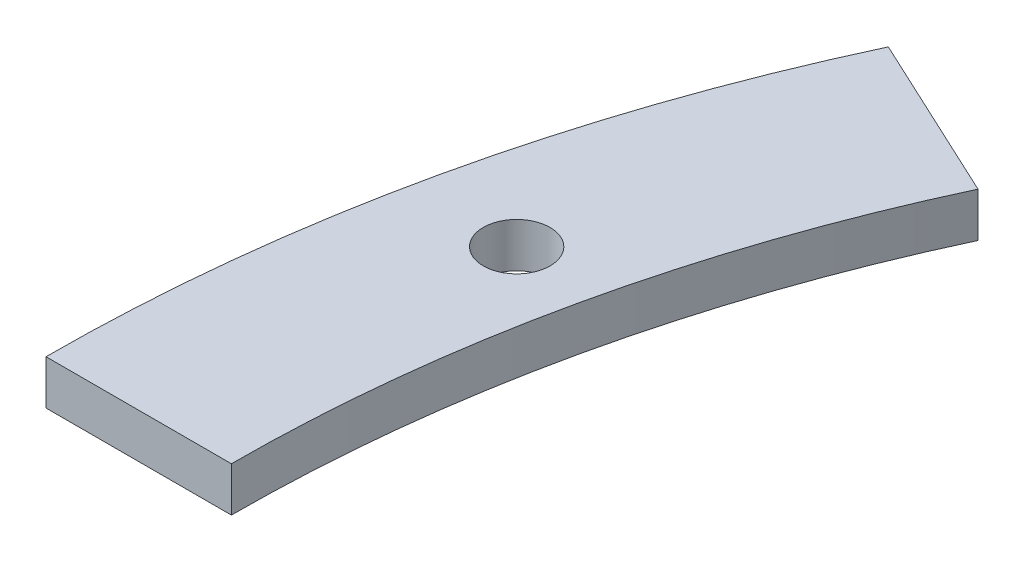
ISO-10303-21;
HEADER;
FILE_DESCRIPTION(('STEP AP214'),'2;1');
FILE_NAME('part.step','',(''),(''),'','','');
FILE_SCHEMA(('AUTOMOTIVE_DESIGN { 1 0 10303 214 1 1 1 1 }'));
ENDSEC;
DATA;
#1=APPLICATION_CONTEXT('core data for automotive mechanical design processes');
#2=APPLICATION_PROTOCOL_DEFINITION('international standard','automotive_design',2000,#1);
#3=PRODUCT_CONTEXT('',#1,'mechanical');
#4=PRODUCT('Part','Part','',(#3));
#5=PRODUCT_RELATED_PRODUCT_CATEGORY('part','',(#4));
#6=PRODUCT_DEFINITION_FORMATION('','',#4);
#7=PRODUCT_DEFINITION_CONTEXT('part definition',#1,'design');
#8=PRODUCT_DEFINITION('design','',#6,#7);
#9=PRODUCT_DEFINITION_SHAPE('','',#8);
#10=(LENGTH_UNIT() NAMED_UNIT(*) SI_UNIT(.MILLI.,.METRE.));
#11=(NAMED_UNIT(*) PLANE_ANGLE_UNIT() SI_UNIT($,.RADIAN.));
#12=(NAMED_UNIT(*) SI_UNIT($,.STERADIAN.) SOLID_ANGLE_UNIT());
#13=UNCERTAINTY_MEASURE_WITH_UNIT(LENGTH_MEASURE(1.E-05),#10,'distance_accuracy_value','');
#14=(GEOMETRIC_REPRESENTATION_CONTEXT(3) GLOBAL_UNCERTAINTY_ASSIGNED_CONTEXT((#13)) GLOBAL_UNIT_ASSIGNED_CONTEXT((#10,
#11,#12)) REPRESENTATION_CONTEXT('',''));
#15=CARTESIAN_POINT('',(0.,0.,0.));
#16=DIRECTION('',(0.,0.,1.));
#17=DIRECTION('',(1.,0.,0.));
#18=AXIS2_PLACEMENT_3D('',#15,#16,#17);
#19=CARTESIAN_POINT('',(0.,3.,0.));
#20=DIRECTION('',(0.,-1.,0.));
#21=DIRECTION('',(0.,0.,-1.));
#22=AXIS2_PLACEMENT_3D('',#19,#20,#21);
#23=CYLINDRICAL_SURFACE('',#22,97.5);
#24=CARTESIAN_POINT('',(0.,0.,0.));
#25=DIRECTION('',(0.,-1.,0.));
#26=DIRECTION('',(0.,0.,1.));
#27=AXIS2_PLACEMENT_3D('',#24,#25,#26);
#28=CIRCLE('',#27,97.5);
#29=CARTESIAN_POINT('',(-97.5,0.,0.));
#30=VERTEX_POINT('',#29);
#31=CARTESIAN_POINT('',(-88.3650092360733,0.,-41.2052805197183));
#32=VERTEX_POINT('',#31);
#33=EDGE_CURVE('E102',#30,#32,#28,.T.);
#34=ORIENTED_EDGE('',*,*,#33,.T.);
#35=DIRECTION('',(0.,-1.,0.));
#36=VECTOR('',#35,1.);
#37=CARTESIAN_POINT('',(-88.3650092360733,3.,-41.2052805197183));
#38=LINE('',#37,#36);
#39=CARTESIAN_POINT('',(-88.3650092360733,3.,-41.2052805197183));
#40=VERTEX_POINT('',#39);
#41=EDGE_CURVE('E11',#40,#32,#38,.T.);
#42=ORIENTED_EDGE('',*,*,#41,.F.);
#43=CARTESIAN_POINT('',(0.,3.,0.));
#44=DIRECTION('',(0.,-1.,0.));
#45=DIRECTION('',(0.,0.,1.));
#46=AXIS2_PLACEMENT_3D('',#43,#44,#45);
#47=CIRCLE('',#46,97.5);
#48=CARTESIAN_POINT('',(-97.5,3.,0.));
#49=VERTEX_POINT('',#48);
#50=EDGE_CURVE('E89',#49,#40,#47,.T.);
#51=ORIENTED_EDGE('',*,*,#50,.F.);
#52=DIRECTION('',(0.,-1.,0.));
#53=VECTOR('',#52,1.);
#54=CARTESIAN_POINT('',(-97.5,3.,0.));
#55=LINE('',#54,#53);
#56=EDGE_CURVE('E98',#49,#30,#55,.T.);
#57=ORIENTED_EDGE('',*,*,#56,.T.);
#58=EDGE_LOOP('',(#34,#42,#51,#57));
#59=FACE_BOUND('',#58,.T.);
#60=ADVANCED_FACE('F37',(#59),#23,.F.);
#61=CARTESIAN_POINT('',(-99.6938565740315,3.,-46.488008791477));
#62=DIRECTION('',(-0.4226182617407,0.,0.90630778703665));
#63=DIRECTION('',(0.90630778703665,0.,0.4226182617407));
#64=AXIS2_PLACEMENT_3D('',#61,#62,#63);
#65=PLANE('',#64);
#66=DIRECTION('',(-0.90630778703665,0.,-0.4226182617407));
#67=VECTOR('',#66,1.);
#68=CARTESIAN_POINT('',(-99.6938565740315,0.,-46.488008791477));
#69=LINE('',#68,#67);
#70=CARTESIAN_POINT('',(-99.6938565740314,0.,-46.4880087914771));
#71=VERTEX_POINT('',#70);
#72=EDGE_CURVE('E93',#32,#71,#69,.T.);
#73=ORIENTED_EDGE('',*,*,#72,.T.);
#74=DIRECTION('',(0.,-1.,0.));
#75=VECTOR('',#74,1.);
#76=CARTESIAN_POINT('',(-99.6938565740314,3.,-46.4880087914771));
#77=LINE('',#76,#75);
#78=CARTESIAN_POINT('',(-99.6938565740314,3.,-46.4880087914771));
#79=VERTEX_POINT('',#78);
#80=EDGE_CURVE('E46',#79,#71,#77,.T.);
#81=ORIENTED_EDGE('',*,*,#80,.F.);
#82=DIRECTION('',(-0.90630778703665,0.,-0.4226182617407));
#83=VECTOR('',#82,1.);
#84=CARTESIAN_POINT('',(-99.6938565740315,3.,-46.488008791477));
#85=LINE('',#84,#83);
#86=EDGE_CURVE('E84',#40,#79,#85,.T.);
#87=ORIENTED_EDGE('',*,*,#86,.F.);
#88=ORIENTED_EDGE('',*,*,#41,.T.);
#89=EDGE_LOOP('',(#73,#81,#87,#88));
#90=FACE_BOUND('',#89,.T.);
#91=ADVANCED_FACE('F92',(#90),#65,.F.);
#92=CARTESIAN_POINT('',(0.,3.,0.));
#93=DIRECTION('',(0.,-1.,0.));
#94=DIRECTION('',(0.,0.,-1.));
#95=AXIS2_PLACEMENT_3D('',#92,#93,#94);
#96=CYLINDRICAL_SURFACE('',#95,110.);
#97=CARTESIAN_POINT('',(0.,0.,0.));
#98=DIRECTION('',(0.,1.,0.));
#99=DIRECTION('',(0.,0.,1.));
#100=AXIS2_PLACEMENT_3D('',#97,#98,#99);
#101=CIRCLE('',#100,110.);
#102=CARTESIAN_POINT('',(-110.,0.,0.));
#103=VERTEX_POINT('',#102);
#104=EDGE_CURVE('E71',#71,#103,#101,.T.);
#105=ORIENTED_EDGE('',*,*,#104,.T.);
#106=DIRECTION('',(0.,-1.,0.));
#107=VECTOR('',#106,1.);
#108=CARTESIAN_POINT('',(-110.,3.,0.));
#109=LINE('',#108,#107);
#110=CARTESIAN_POINT('',(-110.,3.,0.));
#111=VERTEX_POINT('',#110);
#112=EDGE_CURVE('E94',#111,#103,#109,.T.);
#113=ORIENTED_EDGE('',*,*,#112,.F.);
#114=CARTESIAN_POINT('',(0.,3.,0.));
#115=DIRECTION('',(0.,1.,0.));
#116=DIRECTION('',(0.,0.,1.));
#117=AXIS2_PLACEMENT_3D('',#114,#115,#116);
#118=CIRCLE('',#117,110.);
#119=EDGE_CURVE('E87',#79,#111,#118,.T.);
#120=ORIENTED_EDGE('',*,*,#119,.F.);
#121=ORIENTED_EDGE('',*,*,#80,.T.);
#122=EDGE_LOOP('',(#105,#113,#120,#121));
#123=FACE_BOUND('',#122,.T.);
#124=ADVANCED_FACE('F96',(#123),#96,.T.);
#125=CARTESIAN_POINT('',(-110.,3.,0.));
#126=DIRECTION('',(0.,0.,-1.));
#127=DIRECTION('',(-1.,0.,0.));
#128=AXIS2_PLACEMENT_3D('',#125,#126,#127);
#129=PLANE('',#128);
#130=DIRECTION('',(1.,0.,0.));
#131=VECTOR('',#130,1.);
#132=CARTESIAN_POINT('',(-110.,0.,0.));
#133=LINE('',#132,#131);
#134=EDGE_CURVE('E77',#103,#30,#133,.T.);
#135=ORIENTED_EDGE('',*,*,#134,.T.);
#136=ORIENTED_EDGE('',*,*,#56,.F.);
#137=DIRECTION('',(1.,0.,0.));
#138=VECTOR('',#137,1.);
#139=CARTESIAN_POINT('',(-110.,3.,0.));
#140=LINE('',#139,#138);
#141=EDGE_CURVE('E54',#111,#49,#140,.T.);
#142=ORIENTED_EDGE('',*,*,#141,.F.);
#143=ORIENTED_EDGE('',*,*,#112,.T.);
#144=EDGE_LOOP('',(#135,#136,#142,#143));
#145=FACE_BOUND('',#144,.T.);
#146=ADVANCED_FACE('F109',(#145),#129,.F.);
#147=CARTESIAN_POINT('',(0.,3.,0.));
#148=DIRECTION('',(0.,1.,0.));
#149=DIRECTION('',(0.,0.,1.));
#150=AXIS2_PLACEMENT_3D('',#147,#148,#149);
#151=PLANE('',#150);
#152=CARTESIAN_POINT('',(-100.558488733353,3.,-22.2932802356239));
#153=DIRECTION('',(0.,1.,0.));
#154=DIRECTION('',(0.,0.,1.));
#155=AXIS2_PLACEMENT_3D('',#152,#153,#154);
#156=CIRCLE('',#155,2.24999999999999);
#157=CARTESIAN_POINT('',(-100.558488733353,3.,-20.0432802356239));
#158=VERTEX_POINT('',#157);
#159=EDGE_CURVE('E115',#158,#158,#156,.T.);
#160=ORIENTED_EDGE('',*,*,#159,.F.);
#161=EDGE_LOOP('',(#160));
#162=FACE_BOUND('',#161,.T.);
#163=ORIENTED_EDGE('',*,*,#50,.T.);
#164=ORIENTED_EDGE('',*,*,#86,.T.);
#165=ORIENTED_EDGE('',*,*,#119,.T.);
#166=ORIENTED_EDGE('',*,*,#141,.T.);
#167=EDGE_LOOP('',(#163,#164,#165,#166));
#168=FACE_BOUND('',#167,.T.);
#169=ADVANCED_FACE('F85',(#162,#168),#151,.T.);
#170=CARTESIAN_POINT('',(0.,0.,0.));
#171=DIRECTION('',(0.,1.,0.));
#172=DIRECTION('',(0.,0.,1.));
#173=AXIS2_PLACEMENT_3D('',#170,#171,#172);
#174=PLANE('',#173);
#175=CARTESIAN_POINT('',(-100.558488733353,0.,-22.2932802356239));
#176=DIRECTION('',(0.,1.,0.));
#177=DIRECTION('',(0.,0.,1.));
#178=AXIS2_PLACEMENT_3D('',#175,#176,#177);
#179=CIRCLE('',#178,2.24999999999999);
#180=CARTESIAN_POINT('',(-100.558488733353,0.,-20.0432802356239));
#181=VERTEX_POINT('',#180);
#182=EDGE_CURVE('E40',#181,#181,#179,.T.);
#183=ORIENTED_EDGE('',*,*,#182,.T.);
#184=EDGE_LOOP('',(#183));
#185=FACE_BOUND('',#184,.T.);
#186=ORIENTED_EDGE('',*,*,#33,.F.);
#187=ORIENTED_EDGE('',*,*,#134,.F.);
#188=ORIENTED_EDGE('',*,*,#104,.F.);
#189=ORIENTED_EDGE('',*,*,#72,.F.);
#190=EDGE_LOOP('',(#186,#187,#188,#189));
#191=FACE_BOUND('',#190,.T.);
#192=ADVANCED_FACE('F112',(#185,#191),#174,.F.);
#193=CARTESIAN_POINT('',(-100.558488733353,3.,-22.2932802356239));
#194=DIRECTION('',(0.,1.,0.));
#195=DIRECTION('',(0.,0.,1.));
#196=AXIS2_PLACEMENT_3D('',#193,#194,#195);
#197=CYLINDRICAL_SURFACE('',#196,2.24999999999999);
#198=ORIENTED_EDGE('',*,*,#159,.T.);
#199=EDGE_LOOP('',(#198));
#200=FACE_BOUND('',#199,.T.);
#201=ORIENTED_EDGE('',*,*,#182,.F.);
#202=EDGE_LOOP('',(#201));
#203=FACE_BOUND('',#202,.T.);
#204=ADVANCED_FACE('F123',(#200,#203),#197,.F.);
#205=CLOSED_SHELL('',(#60,#91,#124,#146,#169,#192,#204));
#206=MANIFOLD_SOLID_BREP('B2',#205);
#207=ADVANCED_BREP_SHAPE_REPRESENTATION('',(#18,#206),#14);
#208=SHAPE_DEFINITION_REPRESENTATION(#9,#207);
ENDSEC;
END-ISO-10303-21;
